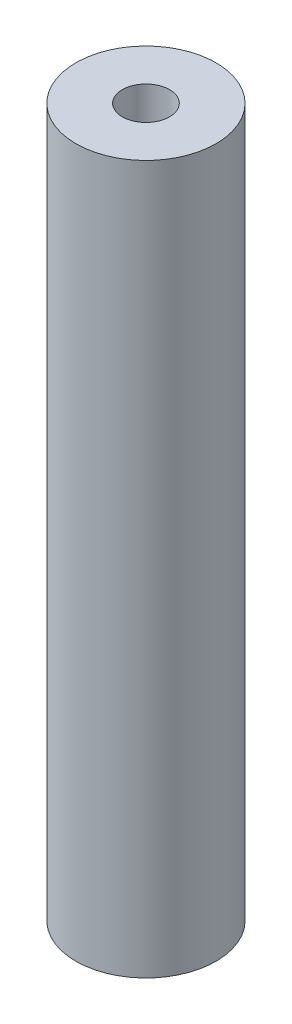
ISO-10303-21;
HEADER;
FILE_DESCRIPTION(('STEP AP214'),'2;1');
FILE_NAME('part.step','',(''),(''),'','','');
FILE_SCHEMA(('AUTOMOTIVE_DESIGN { 1 0 10303 214 1 1 1 1 }'));
ENDSEC;
DATA;
#1=APPLICATION_CONTEXT('core data for automotive mechanical design processes');
#2=APPLICATION_PROTOCOL_DEFINITION('international standard','automotive_design',2000,#1);
#3=PRODUCT_CONTEXT('',#1,'mechanical');
#4=PRODUCT('Part','Part','',(#3));
#5=PRODUCT_RELATED_PRODUCT_CATEGORY('part','',(#4));
#6=PRODUCT_DEFINITION_FORMATION('','',#4);
#7=PRODUCT_DEFINITION_CONTEXT('part definition',#1,'design');
#8=PRODUCT_DEFINITION('design','',#6,#7);
#9=PRODUCT_DEFINITION_SHAPE('','',#8);
#10=(LENGTH_UNIT() NAMED_UNIT(*) SI_UNIT(.MILLI.,.METRE.));
#11=(NAMED_UNIT(*) PLANE_ANGLE_UNIT() SI_UNIT($,.RADIAN.));
#12=(NAMED_UNIT(*) SI_UNIT($,.STERADIAN.) SOLID_ANGLE_UNIT());
#13=UNCERTAINTY_MEASURE_WITH_UNIT(LENGTH_MEASURE(1.E-05),#10,'distance_accuracy_value','');
#14=(GEOMETRIC_REPRESENTATION_CONTEXT(3) GLOBAL_UNCERTAINTY_ASSIGNED_CONTEXT((#13)) GLOBAL_UNIT_ASSIGNED_CONTEXT((#10,
#11,#12)) REPRESENTATION_CONTEXT('',''));
#15=CARTESIAN_POINT('',(0.,0.,0.));
#16=DIRECTION('',(0.,0.,1.));
#17=DIRECTION('',(1.,0.,0.));
#18=AXIS2_PLACEMENT_3D('',#15,#16,#17);
#19=CARTESIAN_POINT('',(0.,30.,0.));
#20=DIRECTION('',(0.,1.,0.));
#21=DIRECTION('',(0.,0.,1.));
#22=AXIS2_PLACEMENT_3D('',#19,#20,#21);
#23=PLANE('',#22);
#24=CARTESIAN_POINT('',(0.,30.,0.));
#25=DIRECTION('',(0.,1.,0.));
#26=DIRECTION('',(0.,0.,1.));
#27=AXIS2_PLACEMENT_3D('',#24,#25,#26);
#28=CIRCLE('',#27,2.97);
#29=CARTESIAN_POINT('',(0.,30.,2.97));
#30=VERTEX_POINT('',#29);
#31=EDGE_CURVE('E10',#30,#30,#28,.T.);
#32=ORIENTED_EDGE('',*,*,#31,.T.);
#33=EDGE_LOOP('',(#32));
#34=FACE_BOUND('',#33,.T.);
#35=CARTESIAN_POINT('',(0.,30.,0.));
#36=DIRECTION('',(0.,1.,0.));
#37=DIRECTION('',(0.,0.,1.));
#38=AXIS2_PLACEMENT_3D('',#35,#36,#37);
#39=CIRCLE('',#38,1.);
#40=CARTESIAN_POINT('',(0.,30.,1.));
#41=VERTEX_POINT('',#40);
#42=EDGE_CURVE('E50',#41,#41,#39,.T.);
#43=ORIENTED_EDGE('',*,*,#42,.F.);
#44=EDGE_LOOP('',(#43));
#45=FACE_BOUND('',#44,.T.);
#46=ADVANCED_FACE('F37',(#34,#45),#23,.T.);
#47=CARTESIAN_POINT('',(0.,0.,0.));
#48=DIRECTION('',(0.,1.,0.));
#49=DIRECTION('',(0.,0.,1.));
#50=AXIS2_PLACEMENT_3D('',#47,#48,#49);
#51=PLANE('',#50);
#52=CARTESIAN_POINT('',(0.,0.,0.));
#53=DIRECTION('',(0.,1.,0.));
#54=DIRECTION('',(0.,0.,1.));
#55=AXIS2_PLACEMENT_3D('',#52,#53,#54);
#56=CIRCLE('',#55,2.97);
#57=CARTESIAN_POINT('',(0.,0.,2.97));
#58=VERTEX_POINT('',#57);
#59=EDGE_CURVE('E41',#58,#58,#56,.T.);
#60=ORIENTED_EDGE('',*,*,#59,.F.);
#61=EDGE_LOOP('',(#60));
#62=FACE_BOUND('',#61,.T.);
#63=CARTESIAN_POINT('',(0.,0.,0.));
#64=DIRECTION('',(0.,1.,0.));
#65=DIRECTION('',(0.,0.,1.));
#66=AXIS2_PLACEMENT_3D('',#63,#64,#65);
#67=CIRCLE('',#66,1.);
#68=CARTESIAN_POINT('',(0.,0.,1.));
#69=VERTEX_POINT('',#68);
#70=EDGE_CURVE('E52',#69,#69,#67,.T.);
#71=ORIENTED_EDGE('',*,*,#70,.T.);
#72=EDGE_LOOP('',(#71));
#73=FACE_BOUND('',#72,.T.);
#74=ADVANCED_FACE('F64',(#62,#73),#51,.F.);
#75=CARTESIAN_POINT('',(0.,30.,0.));
#76=DIRECTION('',(0.,-1.,0.));
#77=DIRECTION('',(0.,0.,-1.));
#78=AXIS2_PLACEMENT_3D('',#75,#76,#77);
#79=CYLINDRICAL_SURFACE('',#78,2.97);
#80=ORIENTED_EDGE('',*,*,#31,.F.);
#81=EDGE_LOOP('',(#80));
#82=FACE_BOUND('',#81,.T.);
#83=ORIENTED_EDGE('',*,*,#59,.T.);
#84=EDGE_LOOP('',(#83));
#85=FACE_BOUND('',#84,.T.);
#86=ADVANCED_FACE('F39',(#82,#85),#79,.T.);
#87=CARTESIAN_POINT('',(0.,30.,0.));
#88=DIRECTION('',(0.,-1.,0.));
#89=DIRECTION('',(0.,0.,-1.));
#90=AXIS2_PLACEMENT_3D('',#87,#88,#89);
#91=CYLINDRICAL_SURFACE('',#90,1.);
#92=ORIENTED_EDGE('',*,*,#42,.T.);
#93=EDGE_LOOP('',(#92));
#94=FACE_BOUND('',#93,.T.);
#95=ORIENTED_EDGE('',*,*,#70,.F.);
#96=EDGE_LOOP('',(#95));
#97=FACE_BOUND('',#96,.T.);
#98=ADVANCED_FACE('F60',(#94,#97),#91,.F.);
#99=CLOSED_SHELL('',(#46,#74,#86,#98));
#100=MANIFOLD_SOLID_BREP('B2',#99);
#101=ADVANCED_BREP_SHAPE_REPRESENTATION('',(#18,#100),#14);
#102=SHAPE_DEFINITION_REPRESENTATION(#9,#101);
ENDSEC;
END-ISO-10303-21;
